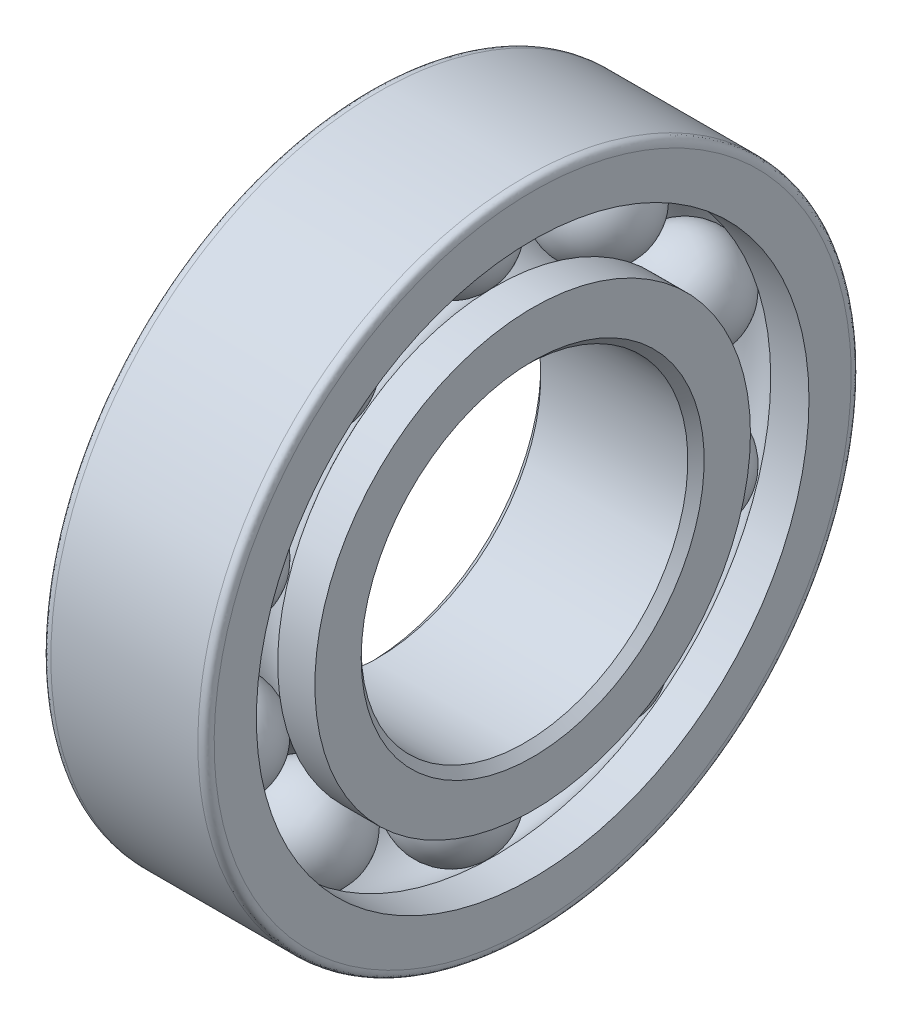
ISO-10303-21;
HEADER;
FILE_DESCRIPTION(('STEP AP214'),'2;1');
FILE_NAME('part.step','',(''),(''),'','','');
FILE_SCHEMA(('AUTOMOTIVE_DESIGN { 1 0 10303 214 1 1 1 1 }'));
ENDSEC;
DATA;
#1=APPLICATION_CONTEXT('core data for automotive mechanical design processes');
#2=APPLICATION_PROTOCOL_DEFINITION('international standard','automotive_design',2000,#1);
#3=PRODUCT_CONTEXT('',#1,'mechanical');
#4=PRODUCT('Part','Part','',(#3));
#5=PRODUCT_RELATED_PRODUCT_CATEGORY('part','',(#4));
#6=PRODUCT_DEFINITION_FORMATION('','',#4);
#7=PRODUCT_DEFINITION_CONTEXT('part definition',#1,'design');
#8=PRODUCT_DEFINITION('design','',#6,#7);
#9=PRODUCT_DEFINITION_SHAPE('','',#8);
#10=(LENGTH_UNIT() NAMED_UNIT(*) SI_UNIT(.MILLI.,.METRE.));
#11=(NAMED_UNIT(*) PLANE_ANGLE_UNIT() SI_UNIT($,.RADIAN.));
#12=(NAMED_UNIT(*) SI_UNIT($,.STERADIAN.) SOLID_ANGLE_UNIT());
#13=UNCERTAINTY_MEASURE_WITH_UNIT(LENGTH_MEASURE(1.E-05),#10,'distance_accuracy_value','');
#14=(GEOMETRIC_REPRESENTATION_CONTEXT(3) GLOBAL_UNCERTAINTY_ASSIGNED_CONTEXT((#13)) GLOBAL_UNIT_ASSIGNED_CONTEXT((#10,
#11,#12)) REPRESENTATION_CONTEXT('',''));
#15=CARTESIAN_POINT('',(0.,0.,0.));
#16=DIRECTION('',(0.,0.,1.));
#17=DIRECTION('',(1.,0.,0.));
#18=AXIS2_PLACEMENT_3D('',#15,#16,#17);
#19=CARTESIAN_POINT('',(0.,7.31351362914959,-5.31357868072386));
#20=DIRECTION('',(-1.,0.,0.));
#21=DIRECTION('',(0.,0.809016994374955,-0.587785252292462));
#22=AXIS2_PLACEMENT_3D('',#19,#20,#21);
#23=SPHERICAL_SURFACE('',#22,1.9);
#24=CARTESIAN_POINT('',(-1.9,7.31351362914959,-5.31357868072386));
#25=VERTEX_POINT('',#24);
#26=VERTEX_LOOP('',#25);
#27=FACE_BOUND('',#26,.T.);
#28=ADVANCED_FACE('F40',(#27),#23,.T.);
#29=CLOSED_SHELL('',(#28));
#30=MANIFOLD_SOLID_BREP('B2',#29);
#31=CARTESIAN_POINT('',(0.,2.79351362914962,-8.59755090730816));
#32=DIRECTION('',(-1.,0.,0.));
#33=DIRECTION('',(0.,0.309016994374958,-0.95105651629515));
#34=AXIS2_PLACEMENT_3D('',#31,#32,#33);
#35=SPHERICAL_SURFACE('',#34,1.9);
#36=CARTESIAN_POINT('',(-1.9,2.79351362914962,-8.59755090730816));
#37=VERTEX_POINT('',#36);
#38=VERTEX_LOOP('',#37);
#39=FACE_BOUND('',#38,.T.);
#40=ADVANCED_FACE('F59',(#39),#35,.T.);
#41=CLOSED_SHELL('',(#40));
#42=MANIFOLD_SOLID_BREP('B6',#41);
#43=CARTESIAN_POINT('',(0.,-2.79351362914944,-8.59755090730821));
#44=DIRECTION('',(-1.,0.,0.));
#45=DIRECTION('',(0.,-0.309016994374938,-0.951056516295157));
#46=AXIS2_PLACEMENT_3D('',#43,#44,#45);
#47=SPHERICAL_SURFACE('',#46,1.9);
#48=CARTESIAN_POINT('',(-1.9,-2.79351362914944,-8.59755090730821));
#49=VERTEX_POINT('',#48);
#50=VERTEX_LOOP('',#49);
#51=FACE_BOUND('',#50,.T.);
#52=ADVANCED_FACE('F78',(#51),#47,.T.);
#53=CLOSED_SHELL('',(#52));
#54=MANIFOLD_SOLID_BREP('B36',#53);
#55=CARTESIAN_POINT('',(0.,-7.31351362914948,-5.31357868072402));
#56=DIRECTION('',(-1.,0.,0.));
#57=DIRECTION('',(0.,-0.809016994374942,-0.58778525229248));
#58=AXIS2_PLACEMENT_3D('',#55,#56,#57);
#59=SPHERICAL_SURFACE('',#58,1.9);
#60=CARTESIAN_POINT('',(-1.9,-7.31351362914948,-5.31357868072402));
#61=VERTEX_POINT('',#60);
#62=VERTEX_LOOP('',#61);
#63=FACE_BOUND('',#62,.T.);
#64=ADVANCED_FACE('F97',(#63),#59,.T.);
#65=CLOSED_SHELL('',(#64));
#66=MANIFOLD_SOLID_BREP('B55',#65);
#67=CARTESIAN_POINT('',(0.,-9.04,0.));
#68=DIRECTION('',(-1.,0.,0.));
#69=DIRECTION('',(0.,-1.,0.));
#70=AXIS2_PLACEMENT_3D('',#67,#68,#69);
#71=SPHERICAL_SURFACE('',#70,1.9);
#72=CARTESIAN_POINT('',(-1.9,-9.04,0.));
#73=VERTEX_POINT('',#72);
#74=VERTEX_LOOP('',#73);
#75=FACE_BOUND('',#74,.T.);
#76=ADVANCED_FACE('F116',(#75),#71,.T.);
#77=CLOSED_SHELL('',(#76));
#78=MANIFOLD_SOLID_BREP('B74',#77);
#79=CARTESIAN_POINT('',(0.,-7.31351362914955,5.31357868072392));
#80=DIRECTION('',(-1.,0.,0.));
#81=DIRECTION('',(0.,-0.809016994374951,0.587785252292469));
#82=AXIS2_PLACEMENT_3D('',#79,#80,#81);
#83=SPHERICAL_SURFACE('',#82,1.9);
#84=CARTESIAN_POINT('',(-1.9,-7.31351362914955,5.31357868072392));
#85=VERTEX_POINT('',#84);
#86=VERTEX_LOOP('',#85);
#87=FACE_BOUND('',#86,.T.);
#88=ADVANCED_FACE('F135',(#87),#83,.T.);
#89=CLOSED_SHELL('',(#88));
#90=MANIFOLD_SOLID_BREP('B93',#89);
#91=CARTESIAN_POINT('',(0.,-2.79351362914956,8.59755090730818));
#92=DIRECTION('',(-1.,0.,0.));
#93=DIRECTION('',(0.,-0.309016994374952,0.951056516295152));
#94=AXIS2_PLACEMENT_3D('',#91,#92,#93);
#95=SPHERICAL_SURFACE('',#94,1.9);
#96=CARTESIAN_POINT('',(-1.9,-2.79351362914956,8.59755090730818));
#97=VERTEX_POINT('',#96);
#98=VERTEX_LOOP('',#97);
#99=FACE_BOUND('',#98,.T.);
#100=ADVANCED_FACE('F154',(#99),#95,.T.);
#101=CLOSED_SHELL('',(#100));
#102=MANIFOLD_SOLID_BREP('B112',#101);
#103=CARTESIAN_POINT('',(0.,2.7935136291495,8.5975509073082));
#104=DIRECTION('',(-1.,0.,0.));
#105=DIRECTION('',(0.,0.309016994374945,0.951056516295155));
#106=AXIS2_PLACEMENT_3D('',#103,#104,#105);
#107=SPHERICAL_SURFACE('',#106,1.9);
#108=CARTESIAN_POINT('',(-1.9,2.7935136291495,8.5975509073082));
#109=VERTEX_POINT('',#108);
#110=VERTEX_LOOP('',#109);
#111=FACE_BOUND('',#110,.T.);
#112=ADVANCED_FACE('F173',(#111),#107,.T.);
#113=CLOSED_SHELL('',(#112));
#114=MANIFOLD_SOLID_BREP('B131',#113);
#115=CARTESIAN_POINT('',(0.,7.31351362914952,5.31357868072397));
#116=DIRECTION('',(-1.,0.,0.));
#117=DIRECTION('',(0.,0.809016994374947,0.587785252292474));
#118=AXIS2_PLACEMENT_3D('',#115,#116,#117);
#119=SPHERICAL_SURFACE('',#118,1.9);
#120=CARTESIAN_POINT('',(-1.9,7.31351362914952,5.31357868072397));
#121=VERTEX_POINT('',#120);
#122=VERTEX_LOOP('',#121);
#123=FACE_BOUND('',#122,.T.);
#124=ADVANCED_FACE('F192',(#123),#119,.T.);
#125=CLOSED_SHELL('',(#124));
#126=MANIFOLD_SOLID_BREP('B150',#125);
#127=CARTESIAN_POINT('',(0.,9.04,0.));
#128=DIRECTION('',(-1.,0.,0.));
#129=DIRECTION('',(0.,1.,0.));
#130=AXIS2_PLACEMENT_3D('',#127,#128,#129);
#131=SPHERICAL_SURFACE('',#130,1.9);
#132=CARTESIAN_POINT('',(-1.9,9.04,0.));
#133=VERTEX_POINT('',#132);
#134=VERTEX_LOOP('',#133);
#135=FACE_BOUND('',#134,.T.);
#136=ADVANCED_FACE('F213',(#135),#131,.T.);
#137=CLOSED_SHELL('',(#136));
#138=MANIFOLD_SOLID_BREP('B169',#137);
#139=CARTESIAN_POINT('',(0.,0.,0.));
#140=DIRECTION('',(1.,0.,0.));
#141=DIRECTION('',(0.,0.,-1.));
#142=AXIS2_PLACEMENT_3D('',#139,#140,#141);
#143=TOROIDAL_SURFACE('',#142,9.04490767290841,1.93996975534355);
#144=CARTESIAN_POINT('',(1.63451846326215,0.,0.));
#145=DIRECTION('',(1.,0.,0.));
#146=DIRECTION('',(0.,0.,-1.));
#147=AXIS2_PLACEMENT_3D('',#144,#145,#146);
#148=CIRCLE('',#147,8.);
#149=CARTESIAN_POINT('',(1.63451846326215,0.,-8.));
#150=VERTEX_POINT('',#149);
#151=EDGE_CURVE('E262',#150,#150,#148,.T.);
#152=ORIENTED_EDGE('',*,*,#151,.F.);
#153=EDGE_LOOP('',(#152));
#154=FACE_BOUND('',#153,.T.);
#155=CARTESIAN_POINT('',(-1.63451846326215,0.,0.));
#156=DIRECTION('',(1.,0.,0.));
#157=DIRECTION('',(0.,0.,-1.));
#158=AXIS2_PLACEMENT_3D('',#155,#156,#157);
#159=CIRCLE('',#158,8.);
#160=CARTESIAN_POINT('',(-1.63451846326215,0.,-8.));
#161=VERTEX_POINT('',#160);
#162=EDGE_CURVE('E253',#161,#161,#159,.T.);
#163=ORIENTED_EDGE('',*,*,#162,.T.);
#164=EDGE_LOOP('',(#163));
#165=FACE_BOUND('',#164,.T.);
#166=ADVANCED_FACE('F233',(#154,#165),#143,.F.);
#167=CARTESIAN_POINT('',(0.,0.,0.));
#168=DIRECTION('',(1.,0.,0.));
#169=DIRECTION('',(0.,0.,-1.));
#170=AXIS2_PLACEMENT_3D('',#167,#168,#169);
#171=CYLINDRICAL_SURFACE('',#170,8.);
#172=CARTESIAN_POINT('',(-3.,0.,0.));
#173=DIRECTION('',(1.,0.,0.));
#174=DIRECTION('',(0.,0.,-1.));
#175=AXIS2_PLACEMENT_3D('',#172,#173,#174);
#176=CIRCLE('',#175,8.);
#177=CARTESIAN_POINT('',(-3.,0.,-8.));
#178=VERTEX_POINT('',#177);
#179=EDGE_CURVE('E256',#178,#178,#176,.T.);
#180=ORIENTED_EDGE('',*,*,#179,.T.);
#181=EDGE_LOOP('',(#180));
#182=FACE_BOUND('',#181,.T.);
#183=ORIENTED_EDGE('',*,*,#162,.F.);
#184=EDGE_LOOP('',(#183));
#185=FACE_BOUND('',#184,.T.);
#186=ADVANCED_FACE('F271',(#182,#185),#171,.T.);
#187=CARTESIAN_POINT('',(-3.,0.,0.));
#188=DIRECTION('',(-1.,0.,0.));
#189=DIRECTION('',(0.,0.,1.));
#190=AXIS2_PLACEMENT_3D('',#187,#188,#189);
#191=PLANE('',#190);
#192=CARTESIAN_POINT('',(-3.,0.,0.));
#193=DIRECTION('',(-1.,0.,0.));
#194=DIRECTION('',(0.,0.,1.));
#195=AXIS2_PLACEMENT_3D('',#192,#193,#194);
#196=CIRCLE('',#195,6.3);
#197=CARTESIAN_POINT('',(-3.,0.,6.3));
#198=VERTEX_POINT('',#197);
#199=EDGE_CURVE('E212',#198,#198,#196,.F.);
#200=ORIENTED_EDGE('',*,*,#199,.T.);
#201=EDGE_LOOP('',(#200));
#202=FACE_BOUND('',#201,.T.);
#203=ORIENTED_EDGE('',*,*,#179,.F.);
#204=EDGE_LOOP('',(#203));
#205=FACE_BOUND('',#204,.T.);
#206=ADVANCED_FACE('F276',(#202,#205),#191,.T.);
#207=CARTESIAN_POINT('',(0.,0.,0.));
#208=DIRECTION('',(1.,0.,0.));
#209=DIRECTION('',(0.,0.,-1.));
#210=AXIS2_PLACEMENT_3D('',#207,#208,#209);
#211=CYLINDRICAL_SURFACE('',#210,6.);
#212=CARTESIAN_POINT('',(2.7,0.,0.));
#213=DIRECTION('',(-1.,0.,0.));
#214=DIRECTION('',(0.,0.,1.));
#215=AXIS2_PLACEMENT_3D('',#212,#213,#214);
#216=CIRCLE('',#215,6.);
#217=CARTESIAN_POINT('',(2.7,0.,6.));
#218=VERTEX_POINT('',#217);
#219=EDGE_CURVE('E244',#218,#218,#216,.F.);
#220=ORIENTED_EDGE('',*,*,#219,.T.);
#221=EDGE_LOOP('',(#220));
#222=FACE_BOUND('',#221,.T.);
#223=CARTESIAN_POINT('',(-2.7,0.,0.));
#224=DIRECTION('',(-1.,0.,0.));
#225=DIRECTION('',(0.,0.,1.));
#226=AXIS2_PLACEMENT_3D('',#223,#224,#225);
#227=CIRCLE('',#226,6.);
#228=CARTESIAN_POINT('',(-2.7,0.,6.));
#229=VERTEX_POINT('',#228);
#230=EDGE_CURVE('E248',#229,#229,#227,.T.);
#231=ORIENTED_EDGE('',*,*,#230,.T.);
#232=EDGE_LOOP('',(#231));
#233=FACE_BOUND('',#232,.T.);
#234=ADVANCED_FACE('F282',(#222,#233),#211,.F.);
#235=CARTESIAN_POINT('',(3.,0.,0.));
#236=DIRECTION('',(-1.,0.,0.));
#237=DIRECTION('',(0.,0.,1.));
#238=AXIS2_PLACEMENT_3D('',#235,#236,#237);
#239=PLANE('',#238);
#240=CARTESIAN_POINT('',(3.,0.,0.));
#241=DIRECTION('',(-1.,0.,0.));
#242=DIRECTION('',(0.,0.,1.));
#243=AXIS2_PLACEMENT_3D('',#240,#241,#242);
#244=CIRCLE('',#243,6.3);
#245=CARTESIAN_POINT('',(3.,0.,6.3));
#246=VERTEX_POINT('',#245);
#247=EDGE_CURVE('E240',#246,#246,#244,.T.);
#248=ORIENTED_EDGE('',*,*,#247,.T.);
#249=EDGE_LOOP('',(#248));
#250=FACE_BOUND('',#249,.T.);
#251=CARTESIAN_POINT('',(3.,0.,0.));
#252=DIRECTION('',(1.,0.,0.));
#253=DIRECTION('',(0.,0.,-1.));
#254=AXIS2_PLACEMENT_3D('',#251,#252,#253);
#255=CIRCLE('',#254,8.);
#256=CARTESIAN_POINT('',(3.,0.,-8.));
#257=VERTEX_POINT('',#256);
#258=EDGE_CURVE('E259',#257,#257,#255,.T.);
#259=ORIENTED_EDGE('',*,*,#258,.T.);
#260=EDGE_LOOP('',(#259));
#261=FACE_BOUND('',#260,.T.);
#262=ADVANCED_FACE('F287',(#250,#261),#239,.F.);
#263=ORIENTED_EDGE('',*,*,#151,.T.);
#264=EDGE_LOOP('',(#263));
#265=FACE_BOUND('',#264,.T.);
#266=ORIENTED_EDGE('',*,*,#258,.F.);
#267=EDGE_LOOP('',(#266));
#268=FACE_BOUND('',#267,.T.);
#269=ADVANCED_FACE('F266',(#265,#268),#171,.T.);
#270=CARTESIAN_POINT('',(2.7,0.,0.));
#271=DIRECTION('',(1.,0.,0.));
#272=DIRECTION('',(0.,0.,-1.));
#273=AXIS2_PLACEMENT_3D('',#270,#271,#272);
#274=CONICAL_SURFACE('',#273,6.,0.78539816339745);
#275=ORIENTED_EDGE('',*,*,#247,.F.);
#276=EDGE_LOOP('',(#275));
#277=FACE_BOUND('',#276,.T.);
#278=ORIENTED_EDGE('',*,*,#219,.F.);
#279=EDGE_LOOP('',(#278));
#280=FACE_BOUND('',#279,.T.);
#281=ADVANCED_FACE('F286',(#277,#280),#274,.F.);
#282=CARTESIAN_POINT('',(-3.,0.,0.));
#283=DIRECTION('',(-1.,0.,0.));
#284=DIRECTION('',(0.,0.,1.));
#285=AXIS2_PLACEMENT_3D('',#282,#283,#284);
#286=CONICAL_SURFACE('',#285,6.3,0.785398163397448);
#287=ORIENTED_EDGE('',*,*,#230,.F.);
#288=EDGE_LOOP('',(#287));
#289=FACE_BOUND('',#288,.T.);
#290=ORIENTED_EDGE('',*,*,#199,.F.);
#291=EDGE_LOOP('',(#290));
#292=FACE_BOUND('',#291,.T.);
#293=ADVANCED_FACE('F235',(#289,#292),#286,.F.);
#294=CLOSED_SHELL('',(#166,#186,#206,#234,#262,#269,#281,#293));
#295=MANIFOLD_SOLID_BREP('B188',#294);
#296=CARTESIAN_POINT('',(0.,0.,0.));
#297=DIRECTION('',(1.,0.,0.));
#298=DIRECTION('',(0.,0.,-1.));
#299=AXIS2_PLACEMENT_3D('',#296,#297,#298);
#300=TOROIDAL_SURFACE('',#299,9.04490767290841,1.93996975534355);
#301=CARTESIAN_POINT('',(-1.59444460557619,0.,0.));
#302=DIRECTION('',(1.,0.,0.));
#303=DIRECTION('',(0.,0.,-1.));
#304=AXIS2_PLACEMENT_3D('',#301,#302,#303);
#305=CIRCLE('',#304,10.15);
#306=CARTESIAN_POINT('',(-1.59444460557619,0.,-10.15));
#307=VERTEX_POINT('',#306);
#308=EDGE_CURVE('E544',#307,#307,#305,.T.);
#309=ORIENTED_EDGE('',*,*,#308,.F.);
#310=EDGE_LOOP('',(#309));
#311=FACE_BOUND('',#310,.T.);
#312=CARTESIAN_POINT('',(1.59444460557619,0.,0.));
#313=DIRECTION('',(1.,0.,0.));
#314=DIRECTION('',(0.,0.,-1.));
#315=AXIS2_PLACEMENT_3D('',#312,#313,#314);
#316=CIRCLE('',#315,10.15);
#317=CARTESIAN_POINT('',(1.59444460557619,0.,-10.15));
#318=VERTEX_POINT('',#317);
#319=EDGE_CURVE('E382',#318,#318,#316,.T.);
#320=ORIENTED_EDGE('',*,*,#319,.T.);
#321=EDGE_LOOP('',(#320));
#322=FACE_BOUND('',#321,.T.);
#323=ADVANCED_FACE('F354',(#311,#322),#300,.F.);
#324=CARTESIAN_POINT('',(0.,0.,0.));
#325=DIRECTION('',(1.,0.,0.));
#326=DIRECTION('',(0.,0.,-1.));
#327=AXIS2_PLACEMENT_3D('',#324,#325,#326);
#328=CYLINDRICAL_SURFACE('',#327,10.15);
#329=ORIENTED_EDGE('',*,*,#319,.F.);
#330=EDGE_LOOP('',(#329));
#331=FACE_BOUND('',#330,.T.);
#332=CARTESIAN_POINT('',(3.,0.,0.));
#333=DIRECTION('',(1.,0.,0.));
#334=DIRECTION('',(0.,0.,-1.));
#335=AXIS2_PLACEMENT_3D('',#332,#333,#334);
#336=CIRCLE('',#335,10.15);
#337=CARTESIAN_POINT('',(3.,0.,-10.15));
#338=VERTEX_POINT('',#337);
#339=EDGE_CURVE('E387',#338,#338,#336,.T.);
#340=ORIENTED_EDGE('',*,*,#339,.T.);
#341=EDGE_LOOP('',(#340));
#342=FACE_BOUND('',#341,.T.);
#343=ADVANCED_FACE('F411',(#331,#342),#328,.F.);
#344=CARTESIAN_POINT('',(3.,0.,0.));
#345=DIRECTION('',(-1.,0.,0.));
#346=DIRECTION('',(0.,0.,1.));
#347=AXIS2_PLACEMENT_3D('',#344,#345,#346);
#348=PLANE('',#347);
#349=CARTESIAN_POINT('',(3.,0.,-11.7));
#350=CARTESIAN_POINT('',(3.,-1.53132032591848,-11.7));
#351=CARTESIAN_POINT('',(3.,-4.5939609777554,-11.09080289751));
#352=CARTESIAN_POINT('',(3.,-8.48853304100759,-8.48853304100755));
#353=CARTESIAN_POINT('',(3.,-11.0908028975099,-4.59396097775548));
#354=CARTESIAN_POINT('',(3.,-12.004598551245,0.));
#355=CARTESIAN_POINT('',(3.,-11.0908028975099,4.59396097775543));
#356=CARTESIAN_POINT('',(3.,-8.48853304100757,8.48853304100759));
#357=CARTESIAN_POINT('',(3.,-4.59396097775544,11.0908028975099));
#358=CARTESIAN_POINT('',(3.,0.,12.004598551245));
#359=CARTESIAN_POINT('',(3.,4.59396097775544,11.0908028975099));
#360=CARTESIAN_POINT('',(3.,8.48853304100757,8.48853304100758));
#361=CARTESIAN_POINT('',(3.,11.0908028975099,4.59396097775543));
#362=CARTESIAN_POINT('',(3.,12.004598551245,0.));
#363=CARTESIAN_POINT('',(3.,11.0908028975099,-4.59396097775544));
#364=CARTESIAN_POINT('',(3.,8.48853304100756,-8.48853304100758));
#365=CARTESIAN_POINT('',(3.,4.59396097775547,-11.0908028975099));
#366=CARTESIAN_POINT('',(3.,1.53132032591848,-11.7));
#367=CARTESIAN_POINT('',(3.,0.,-11.7));
#368=B_SPLINE_CURVE_WITH_KNOTS('',3,(#349,#350,#351,#352,#353,#354,#355,#356,#357,#358,#359,
#360,#361,#362,#363,#364,#365,#366,#367),.UNSPECIFIED.,.T.,.F.,(4,1,1,1,1,1,1,1,1,1,1,1,1,1,1,1,
4),(-3.14159265358979,-2.74889357189107,-2.35619449019235,-1.96349540849362,-1.5707963267949,
-1.17809724509617,-0.785398163397448,-0.392699081698724,0.,0.392699081698724,0.785398163397448,
1.17809724509617,1.5707963267949,1.96349540849362,2.35619449019234,2.74889357189107,
3.14159265358979),.UNSPECIFIED.);
#369=CARTESIAN_POINT('',(3.,0.,-11.7));
#370=VERTEX_POINT('',#369);
#371=EDGE_CURVE('E377',#370,#370,#368,.F.);
#372=ORIENTED_EDGE('',*,*,#371,.T.);
#373=EDGE_LOOP('',(#372));
#374=FACE_BOUND('',#373,.T.);
#375=ORIENTED_EDGE('',*,*,#339,.F.);
#376=EDGE_LOOP('',(#375));
#377=FACE_BOUND('',#376,.T.);
#378=ADVANCED_FACE('F400',(#374,#377),#348,.F.);
#379=CARTESIAN_POINT('',(0.,0.,0.));
#380=DIRECTION('',(1.,0.,0.));
#381=DIRECTION('',(0.,0.,-1.));
#382=AXIS2_PLACEMENT_3D('',#379,#380,#381);
#383=CYLINDRICAL_SURFACE('',#382,12.);
#384=CARTESIAN_POINT('',(2.7,0.,-12.));
#385=CARTESIAN_POINT('',(2.7,1.57058494965998,-12.));
#386=CARTESIAN_POINT('',(2.7,4.71175484897997,-11.3751824589845));
#387=CARTESIAN_POINT('',(2.7,8.70618773436671,-8.70618773436675));
#388=CARTESIAN_POINT('',(2.7,11.3751824589846,-4.71175484897994));
#389=CARTESIAN_POINT('',(2.7,12.3124087705077,0.));
#390=CARTESIAN_POINT('',(2.7,11.3751824589846,4.71175484897992));
#391=CARTESIAN_POINT('',(2.7,8.70618773436673,8.70618773436674));
#392=CARTESIAN_POINT('',(2.7,4.71175484897993,11.3751824589845));
#393=CARTESIAN_POINT('',(2.7,0.,12.3124087705077));
#394=CARTESIAN_POINT('',(2.7,-4.71175484897993,11.3751824589845));
#395=CARTESIAN_POINT('',(2.7,-8.70618773436673,8.70618773436675));
#396=CARTESIAN_POINT('',(2.7,-11.3751824589845,4.71175484897993));
#397=CARTESIAN_POINT('',(2.7,-12.3124087705077,0.));
#398=CARTESIAN_POINT('',(2.7,-11.3751824589845,-4.71175484897997));
#399=CARTESIAN_POINT('',(2.7,-8.70618773436675,-8.70618773436671));
#400=CARTESIAN_POINT('',(2.7,-4.7117548489799,-11.3751824589846));
#401=CARTESIAN_POINT('',(2.7,-1.57058494965998,-12.));
#402=CARTESIAN_POINT('',(2.7,0.,-12.));
#403=B_SPLINE_CURVE_WITH_KNOTS('',3,(#384,#385,#386,#387,#388,#389,#390,#391,#392,#393,#394,
#395,#396,#397,#398,#399,#400,#401,#402),.UNSPECIFIED.,.T.,.F.,(4,1,1,1,1,1,1,1,1,1,1,1,1,1,1,1,
4),(-3.14159265358979,-2.74889357189107,-2.35619449019234,-1.96349540849362,-1.5707963267949,
-1.17809724509617,-0.785398163397448,-0.392699081698724,0.,0.392699081698724,0.785398163397448,
1.17809724509617,1.5707963267949,1.96349540849362,2.35619449019235,2.74889357189107,
3.14159265358979),.UNSPECIFIED.);
#404=CARTESIAN_POINT('',(2.7,0.,-12.));
#405=VERTEX_POINT('',#404);
#406=EDGE_CURVE('E367',#405,#405,#403,.F.);
#407=ORIENTED_EDGE('',*,*,#406,.T.);
#408=EDGE_LOOP('',(#407));
#409=FACE_BOUND('',#408,.T.);
#410=CARTESIAN_POINT('',(-2.7,0.,-12.));
#411=CARTESIAN_POINT('',(-2.7,-1.57058494965998,-12.));
#412=CARTESIAN_POINT('',(-2.7,-4.7117548489799,-11.3751824589846));
#413=CARTESIAN_POINT('',(-2.7,-8.70618773436675,-8.70618773436671));
#414=CARTESIAN_POINT('',(-2.7,-11.3751824589845,-4.71175484897997));
#415=CARTESIAN_POINT('',(-2.7,-12.3124087705077,0.));
#416=CARTESIAN_POINT('',(-2.7,-11.3751824589845,4.71175484897993));
#417=CARTESIAN_POINT('',(-2.7,-8.70618773436673,8.70618773436675));
#418=CARTESIAN_POINT('',(-2.7,-4.71175484897993,11.3751824589845));
#419=CARTESIAN_POINT('',(-2.7,0.,12.3124087705077));
#420=CARTESIAN_POINT('',(-2.7,4.71175484897993,11.3751824589845));
#421=CARTESIAN_POINT('',(-2.7,8.70618773436673,8.70618773436674));
#422=CARTESIAN_POINT('',(-2.7,11.3751824589846,4.71175484897992));
#423=CARTESIAN_POINT('',(-2.7,12.3124087705077,0.));
#424=CARTESIAN_POINT('',(-2.7,11.3751824589846,-4.71175484897994));
#425=CARTESIAN_POINT('',(-2.7,8.70618773436671,-8.70618773436675));
#426=CARTESIAN_POINT('',(-2.7,4.71175484897997,-11.3751824589845));
#427=CARTESIAN_POINT('',(-2.7,1.57058494965998,-12.));
#428=CARTESIAN_POINT('',(-2.7,0.,-12.));
#429=B_SPLINE_CURVE_WITH_KNOTS('',3,(#410,#411,#412,#413,#414,#415,#416,#417,#418,#419,#420,
#421,#422,#423,#424,#425,#426,#427,#428),.UNSPECIFIED.,.T.,.F.,(4,1,1,1,1,1,1,1,1,1,1,1,1,1,1,1,
4),(-3.14159265358979,-2.74889357189107,-2.35619449019235,-1.96349540849362,-1.5707963267949,
-1.17809724509617,-0.785398163397448,-0.392699081698724,0.,0.392699081698724,0.785398163397448,
1.17809724509617,1.5707963267949,1.96349540849362,2.35619449019234,2.74889357189107,
3.14159265358979),.UNSPECIFIED.);
#430=CARTESIAN_POINT('',(-2.7,0.,-12.));
#431=VERTEX_POINT('',#430);
#432=EDGE_CURVE('E372',#431,#431,#429,.F.);
#433=ORIENTED_EDGE('',*,*,#432,.T.);
#434=EDGE_LOOP('',(#433));
#435=FACE_BOUND('',#434,.T.);
#436=ADVANCED_FACE('F410',(#409,#435),#383,.T.);
#437=CARTESIAN_POINT('',(-3.,0.,0.));
#438=DIRECTION('',(-1.,0.,0.));
#439=DIRECTION('',(0.,0.,1.));
#440=AXIS2_PLACEMENT_3D('',#437,#438,#439);
#441=PLANE('',#440);
#442=CARTESIAN_POINT('',(-3.,0.,-11.7));
#443=CARTESIAN_POINT('',(-3.,1.53132032591848,-11.7));
#444=CARTESIAN_POINT('',(-3.,4.59396097775547,-11.0908028975099));
#445=CARTESIAN_POINT('',(-3.,8.48853304100755,-8.48853304100757));
#446=CARTESIAN_POINT('',(-3.,11.0908028975099,-4.59396097775544));
#447=CARTESIAN_POINT('',(-3.,12.004598551245,0.));
#448=CARTESIAN_POINT('',(-3.,11.0908028975099,4.59396097775542));
#449=CARTESIAN_POINT('',(-3.,8.48853304100757,8.48853304100757));
#450=CARTESIAN_POINT('',(-3.,4.59396097775544,11.0908028975099));
#451=CARTESIAN_POINT('',(-3.,0.,12.004598551245));
#452=CARTESIAN_POINT('',(-3.,-4.59396097775543,11.0908028975099));
#453=CARTESIAN_POINT('',(-3.,-8.48853304100756,8.48853304100758));
#454=CARTESIAN_POINT('',(-3.,-11.0908028975099,4.59396097775543));
#455=CARTESIAN_POINT('',(-3.,-12.004598551245,0.));
#456=CARTESIAN_POINT('',(-3.,-11.0908028975099,-4.59396097775547));
#457=CARTESIAN_POINT('',(-3.,-8.48853304100758,-8.48853304100754));
#458=CARTESIAN_POINT('',(-3.,-4.5939609777554,-11.09080289751));
#459=CARTESIAN_POINT('',(-3.,-1.53132032591848,-11.7));
#460=CARTESIAN_POINT('',(-3.,0.,-11.7));
#461=B_SPLINE_CURVE_WITH_KNOTS('',3,(#442,#443,#444,#445,#446,#447,#448,#449,#450,#451,#452,
#453,#454,#455,#456,#457,#458,#459,#460),.UNSPECIFIED.,.T.,.F.,(4,1,1,1,1,1,1,1,1,1,1,1,1,1,1,1,
4),(-3.14159265358979,-2.74889357189107,-2.35619449019234,-1.96349540849362,-1.5707963267949,
-1.17809724509617,-0.785398163397448,-0.392699081698724,0.,0.392699081698724,0.785398163397448,
1.17809724509617,1.5707963267949,1.96349540849362,2.35619449019235,2.74889357189107,
3.14159265358979),.UNSPECIFIED.);
#462=CARTESIAN_POINT('',(-3.,0.,-11.7));
#463=VERTEX_POINT('',#462);
#464=EDGE_CURVE('E232',#463,#463,#461,.F.);
#465=ORIENTED_EDGE('',*,*,#464,.T.);
#466=EDGE_LOOP('',(#465));
#467=FACE_BOUND('',#466,.T.);
#468=CARTESIAN_POINT('',(-3.,0.,0.));
#469=DIRECTION('',(1.,0.,0.));
#470=DIRECTION('',(0.,0.,-1.));
#471=AXIS2_PLACEMENT_3D('',#468,#469,#470);
#472=CIRCLE('',#471,10.15);
#473=CARTESIAN_POINT('',(-3.,0.,-10.15));
#474=VERTEX_POINT('',#473);
#475=EDGE_CURVE('E392',#474,#474,#472,.T.);
#476=ORIENTED_EDGE('',*,*,#475,.T.);
#477=EDGE_LOOP('',(#476));
#478=FACE_BOUND('',#477,.T.);
#479=ADVANCED_FACE('F470',(#467,#478),#441,.T.);
#480=ORIENTED_EDGE('',*,*,#475,.F.);
#481=EDGE_LOOP('',(#480));
#482=FACE_BOUND('',#481,.T.);
#483=ORIENTED_EDGE('',*,*,#308,.T.);
#484=EDGE_LOOP('',(#483));
#485=FACE_BOUND('',#484,.T.);
#486=ADVANCED_FACE('F424',(#482,#485),#328,.F.);
#487=CARTESIAN_POINT('',(2.7,0.,-12.));
#488=CARTESIAN_POINT('',(2.7,-1.57058494965998,-12.));
#489=CARTESIAN_POINT('',(2.7,-4.7117548489799,-11.3751824589846));
#490=CARTESIAN_POINT('',(2.7,-8.70618773436675,-8.70618773436671));
#491=CARTESIAN_POINT('',(2.7,-11.3751824589845,-4.71175484897997));
#492=CARTESIAN_POINT('',(2.7,-12.3124087705077,0.));
#493=CARTESIAN_POINT('',(2.7,-11.3751824589845,4.71175484897993));
#494=CARTESIAN_POINT('',(2.7,-8.70618773436673,8.70618773436675));
#495=CARTESIAN_POINT('',(2.7,-4.71175484897993,11.3751824589845));
#496=CARTESIAN_POINT('',(2.7,0.,12.3124087705077));
#497=CARTESIAN_POINT('',(2.7,4.71175484897993,11.3751824589845));
#498=CARTESIAN_POINT('',(2.7,8.70618773436673,8.70618773436674));
#499=CARTESIAN_POINT('',(2.7,11.3751824589846,4.71175484897992));
#500=CARTESIAN_POINT('',(2.7,12.3124087705077,0.));
#501=CARTESIAN_POINT('',(2.7,11.3751824589846,-4.71175484897994));
#502=CARTESIAN_POINT('',(2.7,8.70618773436671,-8.70618773436675));
#503=CARTESIAN_POINT('',(2.7,4.71175484897997,-11.3751824589845));
#504=CARTESIAN_POINT('',(2.7,1.57058494965998,-12.));
#505=CARTESIAN_POINT('',(2.7,0.,-12.));
#506=CARTESIAN_POINT('',(2.75045941546018,0.,-12.));
#507=CARTESIAN_POINT('',(2.75045941546018,-1.57058494965998,-12.));
#508=CARTESIAN_POINT('',(2.75045941546019,-4.7117548489799,-11.3751824589846));
#509=CARTESIAN_POINT('',(2.75045941546018,-8.70618773436675,-8.70618773436671));
#510=CARTESIAN_POINT('',(2.75045941546019,-11.3751824589845,-4.71175484897997));
#511=CARTESIAN_POINT('',(2.75045941546018,-12.3124087705077,0.));
#512=CARTESIAN_POINT('',(2.75045941546019,-11.3751824589845,4.71175484897993));
#513=CARTESIAN_POINT('',(2.75045941546018,-8.70618773436673,8.70618773436675));
#514=CARTESIAN_POINT('',(2.75045941546018,-4.71175484897993,11.3751824589845));
#515=CARTESIAN_POINT('',(2.75045941546018,0.,12.3124087705077));
#516=CARTESIAN_POINT('',(2.75045941546018,4.71175484897993,11.3751824589845));
#517=CARTESIAN_POINT('',(2.75045941546018,8.70618773436673,8.70618773436674));
#518=CARTESIAN_POINT('',(2.75045941546018,11.3751824589846,4.71175484897992));
#519=CARTESIAN_POINT('',(2.75045941546018,12.3124087705077,0.));
#520=CARTESIAN_POINT('',(2.75045941546019,11.3751824589846,-4.71175484897994));
#521=CARTESIAN_POINT('',(2.75045941546018,8.70618773436671,-8.70618773436675));
#522=CARTESIAN_POINT('',(2.75045941546019,4.71175484897997,-11.3751824589845));
#523=CARTESIAN_POINT('',(2.75045941546018,1.57058494965998,-12.));
#524=CARTESIAN_POINT('',(2.75045941546018,0.,-12.));
#525=CARTESIAN_POINT('',(2.80091883092037,0.,-12.));
#526=CARTESIAN_POINT('',(2.80091883092037,-1.57058494965998,-12.));
#527=CARTESIAN_POINT('',(2.80091883092037,-4.7117548489799,-11.3751824589846));
#528=CARTESIAN_POINT('',(2.80091883092037,-8.70618773436675,-8.70618773436671));
#529=CARTESIAN_POINT('',(2.80091883092037,-11.3751824589845,-4.71175484897997));
#530=CARTESIAN_POINT('',(2.80091883092037,-12.3124087705077,0.));
#531=CARTESIAN_POINT('',(2.80091883092037,-11.3751824589845,4.71175484897993));
#532=CARTESIAN_POINT('',(2.80091883092037,-8.70618773436673,8.70618773436675));
#533=CARTESIAN_POINT('',(2.80091883092037,-4.71175484897993,11.3751824589845));
#534=CARTESIAN_POINT('',(2.80091883092037,0.,12.3124087705077));
#535=CARTESIAN_POINT('',(2.80091883092037,4.71175484897993,11.3751824589845));
#536=CARTESIAN_POINT('',(2.80091883092037,8.70618773436673,8.70618773436674));
#537=CARTESIAN_POINT('',(2.80091883092037,11.3751824589846,4.71175484897992));
#538=CARTESIAN_POINT('',(2.80091883092037,12.3124087705077,0.));
#539=CARTESIAN_POINT('',(2.80091883092037,11.3751824589846,-4.71175484897994));
#540=CARTESIAN_POINT('',(2.80091883092037,8.70618773436671,-8.70618773436675));
#541=CARTESIAN_POINT('',(2.80091883092037,4.71175484897997,-11.3751824589845));
#542=CARTESIAN_POINT('',(2.80091883092037,1.57058494965998,-12.));
#543=CARTESIAN_POINT('',(2.80091883092037,0.,-12.));
#544=CARTESIAN_POINT('',(2.91213203435596,0.,-11.9784924240492));
#545=CARTESIAN_POINT('',(2.91213203435596,-1.56776999340231,-11.9784924240492));
#546=CARTESIAN_POINT('',(2.91213203435597,-4.70330998020689,-11.3547947422603));
#547=CARTESIAN_POINT('',(2.91213203435596,-8.6905836515385,-8.69058365153846));
#548=CARTESIAN_POINT('',(2.91213203435597,-11.3547947422603,-4.70330998020696));
#549=CARTESIAN_POINT('',(2.91213203435596,-12.2903412649436,0.));
#550=CARTESIAN_POINT('',(2.91213203435596,-11.3547947422603,4.70330998020692));
#551=CARTESIAN_POINT('',(2.91213203435596,-8.69058365153848,8.69058365153849));
#552=CARTESIAN_POINT('',(2.91213203435596,-4.70330998020692,11.3547947422603));
#553=CARTESIAN_POINT('',(2.91213203435596,0.,12.2903412649436));
#554=CARTESIAN_POINT('',(2.91213203435596,4.70330998020693,11.3547947422603));
#555=CARTESIAN_POINT('',(2.91213203435596,8.69058365153848,8.69058365153849));
#556=CARTESIAN_POINT('',(2.91213203435596,11.3547947422603,4.70330998020691));
#557=CARTESIAN_POINT('',(2.91213203435596,12.2903412649436,0.));
#558=CARTESIAN_POINT('',(2.91213203435597,11.3547947422603,-4.70330998020693));
#559=CARTESIAN_POINT('',(2.91213203435596,8.69058365153847,-8.69058365153849));
#560=CARTESIAN_POINT('',(2.91213203435597,4.70330998020696,-11.3547947422603));
#561=CARTESIAN_POINT('',(2.91213203435596,1.56776999340231,-11.9784924240492));
#562=CARTESIAN_POINT('',(2.91213203435596,0.,-11.9784924240492));
#563=CARTESIAN_POINT('',(2.97849242404918,0.,-11.912132034356));
#564=CARTESIAN_POINT('',(2.97849242404918,-1.55908460762683,-11.912132034356));
#565=CARTESIAN_POINT('',(2.97849242404918,-4.67725382288045,-11.2918896138595));
#566=CARTESIAN_POINT('',(2.97849242404917,-8.64243815063893,-8.64243815063889));
#567=CARTESIAN_POINT('',(2.97849242404918,-11.2918896138595,-4.67725382288053));
#568=CARTESIAN_POINT('',(2.97849242404918,-12.2222532446042,0.));
#569=CARTESIAN_POINT('',(2.97849242404918,-11.2918896138595,4.67725382288049));
#570=CARTESIAN_POINT('',(2.97849242404918,-8.6424381506389,8.64243815063892));
#571=CARTESIAN_POINT('',(2.97849242404917,-4.67725382288049,11.2918896138595));
#572=CARTESIAN_POINT('',(2.97849242404918,0.,12.2222532446042));
#573=CARTESIAN_POINT('',(2.97849242404918,4.67725382288049,11.2918896138595));
#574=CARTESIAN_POINT('',(2.97849242404918,8.64243815063891,8.64243815063892));
#575=CARTESIAN_POINT('',(2.97849242404918,11.2918896138595,4.67725382288048));
#576=CARTESIAN_POINT('',(2.97849242404918,12.2222532446042,0.));
#577=CARTESIAN_POINT('',(2.97849242404918,11.2918896138595,-4.67725382288049));
#578=CARTESIAN_POINT('',(2.97849242404917,8.64243815063889,-8.64243815063892));
#579=CARTESIAN_POINT('',(2.97849242404918,4.67725382288053,-11.2918896138595));
#580=CARTESIAN_POINT('',(2.97849242404918,1.55908460762683,-11.912132034356));
#581=CARTESIAN_POINT('',(2.97849242404918,0.,-11.912132034356));
#582=CARTESIAN_POINT('',(3.,0.,-11.8009188309204));
#583=CARTESIAN_POINT('',(3.,-1.54452879233354,-11.8009188309204));
#584=CARTESIAN_POINT('',(3.,-4.6335863770006,-11.1864670737822));
#585=CARTESIAN_POINT('',(3.,-8.56175123166805,-8.561751231668));
#586=CARTESIAN_POINT('',(3.,-11.1864670737821,-4.63358637700068));
#587=CARTESIAN_POINT('',(3.,-12.1081447094895,0.));
#588=CARTESIAN_POINT('',(3.,-11.1864670737821,4.63358637700063));
#589=CARTESIAN_POINT('',(3.,-8.56175123166802,8.56175123166804));
#590=CARTESIAN_POINT('',(3.,-4.63358637700063,11.1864670737821));
#591=CARTESIAN_POINT('',(3.,0.,12.1081447094895));
#592=CARTESIAN_POINT('',(3.,4.63358637700064,11.1864670737821));
#593=CARTESIAN_POINT('',(3.,8.56175123166803,8.56175123166804));
#594=CARTESIAN_POINT('',(3.,11.1864670737822,4.63358637700063));
#595=CARTESIAN_POINT('',(3.,12.1081447094895,0.));
#596=CARTESIAN_POINT('',(3.,11.1864670737822,-4.63358637700064));
#597=CARTESIAN_POINT('',(3.,8.56175123166801,-8.56175123166804));
#598=CARTESIAN_POINT('',(3.,4.63358637700067,-11.1864670737821));
#599=CARTESIAN_POINT('',(3.,1.54452879233355,-11.8009188309204));
#600=CARTESIAN_POINT('',(3.,0.,-11.8009188309204));
#601=CARTESIAN_POINT('',(3.,0.,-11.7504594154602));
#602=CARTESIAN_POINT('',(3.,-1.53792455912601,-11.7504594154602));
#603=CARTESIAN_POINT('',(3.,-4.613773677378,-11.1386349856461));
#604=CARTESIAN_POINT('',(3.,-8.52514213633782,-8.52514213633777));
#605=CARTESIAN_POINT('',(3.,-11.138634985646,-4.61377367737807));
#606=CARTESIAN_POINT('',(3.,-12.0563716303673,0.));
#607=CARTESIAN_POINT('',(3.,-11.138634985646,4.61377367737803));
#608=CARTESIAN_POINT('',(3.,-8.52514213633779,8.52514213633781));
#609=CARTESIAN_POINT('',(3.,-4.61377367737803,11.138634985646));
#610=CARTESIAN_POINT('',(3.,0.,12.0563716303673));
#611=CARTESIAN_POINT('',(3.,4.61377367737804,11.138634985646));
#612=CARTESIAN_POINT('',(3.,8.5251421363378,8.5251421363378));
#613=CARTESIAN_POINT('',(3.,11.138634985646,4.61377367737802));
#614=CARTESIAN_POINT('',(3.,12.0563716303673,0.));
#615=CARTESIAN_POINT('',(3.,11.138634985646,-4.61377367737804));
#616=CARTESIAN_POINT('',(3.,8.52514213633778,-8.52514213633781));
#617=CARTESIAN_POINT('',(3.,4.61377367737807,-11.138634985646));
#618=CARTESIAN_POINT('',(3.,1.53792455912601,-11.7504594154602));
#619=CARTESIAN_POINT('',(3.,0.,-11.7504594154602));
#620=CARTESIAN_POINT('',(3.,0.,-11.7));
#621=CARTESIAN_POINT('',(3.,-1.53132032591848,-11.7));
#622=CARTESIAN_POINT('',(3.,-4.5939609777554,-11.09080289751));
#623=CARTESIAN_POINT('',(3.,-8.48853304100758,-8.48853304100754));
#624=CARTESIAN_POINT('',(3.,-11.0908028975099,-4.59396097775547));
#625=CARTESIAN_POINT('',(3.,-12.004598551245,0.));
#626=CARTESIAN_POINT('',(3.,-11.0908028975099,4.59396097775543));
#627=CARTESIAN_POINT('',(3.,-8.48853304100756,8.48853304100758));
#628=CARTESIAN_POINT('',(3.,-4.59396097775543,11.0908028975099));
#629=CARTESIAN_POINT('',(3.,0.,12.004598551245));
#630=CARTESIAN_POINT('',(3.,4.59396097775544,11.0908028975099));
#631=CARTESIAN_POINT('',(3.,8.48853304100757,8.48853304100757));
#632=CARTESIAN_POINT('',(3.,11.0908028975099,4.59396097775542));
#633=CARTESIAN_POINT('',(3.,12.004598551245,0.));
#634=CARTESIAN_POINT('',(3.,11.0908028975099,-4.59396097775544));
#635=CARTESIAN_POINT('',(3.,8.48853304100755,-8.48853304100757));
#636=CARTESIAN_POINT('',(3.,4.59396097775547,-11.0908028975099));
#637=CARTESIAN_POINT('',(3.,1.53132032591848,-11.7));
#638=CARTESIAN_POINT('',(3.,0.,-11.7));
#639=B_SPLINE_SURFACE_WITH_KNOTS('',5,3,((#487,#488,#489,#490,#491,#492,#493,#494,#495,#496,
#497,#498,#499,#500,#501,#502,#503,#504,#505),(#506,#507,#508,#509,#510,#511,#512,#513,#514,
#515,#516,#517,#518,#519,#520,#521,#522,#523,#524),(#525,#526,#527,#528,#529,#530,#531,#532,
#533,#534,#535,#536,#537,#538,#539,#540,#541,#542,#543),(#544,#545,#546,#547,#548,#549,#550,
#551,#552,#553,#554,#555,#556,#557,#558,#559,#560,#561,#562),(#563,#564,#565,#566,#567,#568,
#569,#570,#571,#572,#573,#574,#575,#576,#577,#578,#579,#580,#581),(#582,#583,#584,#585,#586,
#587,#588,#589,#590,#591,#592,#593,#594,#595,#596,#597,#598,#599,#600),(#601,#602,#603,#604,
#605,#606,#607,#608,#609,#610,#611,#612,#613,#614,#615,#616,#617,#618,#619),(#620,#621,#622,
#623,#624,#625,#626,#627,#628,#629,#630,#631,#632,#633,#634,#635,#636,#637,#638)),.UNSPECIFIED.,
.F.,.T.,.F.,(6,2,6),(4,1,1,1,1,1,1,1,1,1,1,1,1,1,1,1,4),(0.,0.5,1.),(-3.14159265358979,
-2.74889357189107,-2.35619449019235,-1.96349540849362,-1.5707963267949,-1.17809724509617,
-0.785398163397448,-0.392699081698724,0.,0.392699081698724,0.785398163397448,1.17809724509617,
1.5707963267949,1.96349540849362,2.35619449019234,2.74889357189107,3.14159265358979),.UNSPECIFIED.);
#640=ORIENTED_EDGE('',*,*,#406,.F.);
#641=EDGE_LOOP('',(#640));
#642=FACE_BOUND('',#641,.T.);
#643=ORIENTED_EDGE('',*,*,#371,.F.);
#644=EDGE_LOOP('',(#643));
#645=FACE_BOUND('',#644,.T.);
#646=ADVANCED_FACE('F417',(#642,#645),#639,.T.);
#647=CARTESIAN_POINT('',(-3.,0.,-11.7));
#648=CARTESIAN_POINT('',(-3.,-1.53132032591848,-11.7));
#649=CARTESIAN_POINT('',(-3.,-4.5939609777554,-11.09080289751));
#650=CARTESIAN_POINT('',(-3.,-8.48853304100758,-8.48853304100754));
#651=CARTESIAN_POINT('',(-3.,-11.0908028975099,-4.59396097775547));
#652=CARTESIAN_POINT('',(-3.,-12.004598551245,0.));
#653=CARTESIAN_POINT('',(-3.,-11.0908028975099,4.59396097775543));
#654=CARTESIAN_POINT('',(-3.,-8.48853304100756,8.48853304100758));
#655=CARTESIAN_POINT('',(-3.,-4.59396097775543,11.0908028975099));
#656=CARTESIAN_POINT('',(-3.,0.,12.004598551245));
#657=CARTESIAN_POINT('',(-3.,4.59396097775544,11.0908028975099));
#658=CARTESIAN_POINT('',(-3.,8.48853304100757,8.48853304100757));
#659=CARTESIAN_POINT('',(-3.,11.0908028975099,4.59396097775542));
#660=CARTESIAN_POINT('',(-3.,12.004598551245,0.));
#661=CARTESIAN_POINT('',(-3.,11.0908028975099,-4.59396097775544));
#662=CARTESIAN_POINT('',(-3.,8.48853304100755,-8.48853304100757));
#663=CARTESIAN_POINT('',(-3.,4.59396097775547,-11.0908028975099));
#664=CARTESIAN_POINT('',(-3.,1.53132032591848,-11.7));
#665=CARTESIAN_POINT('',(-3.,0.,-11.7));
#666=CARTESIAN_POINT('',(-3.,0.,-11.7504594154602));
#667=CARTESIAN_POINT('',(-3.,-1.53792455912601,-11.7504594154602));
#668=CARTESIAN_POINT('',(-3.,-4.613773677378,-11.1386349856461));
#669=CARTESIAN_POINT('',(-3.,-8.52514213633782,-8.52514213633777));
#670=CARTESIAN_POINT('',(-3.,-11.138634985646,-4.61377367737807));
#671=CARTESIAN_POINT('',(-3.,-12.0563716303673,0.));
#672=CARTESIAN_POINT('',(-3.,-11.138634985646,4.61377367737803));
#673=CARTESIAN_POINT('',(-3.,-8.52514213633779,8.52514213633781));
#674=CARTESIAN_POINT('',(-3.,-4.61377367737803,11.138634985646));
#675=CARTESIAN_POINT('',(-3.,0.,12.0563716303673));
#676=CARTESIAN_POINT('',(-3.,4.61377367737804,11.138634985646));
#677=CARTESIAN_POINT('',(-3.,8.5251421363378,8.5251421363378));
#678=CARTESIAN_POINT('',(-3.,11.138634985646,4.61377367737802));
#679=CARTESIAN_POINT('',(-3.,12.0563716303673,0.));
#680=CARTESIAN_POINT('',(-3.,11.138634985646,-4.61377367737804));
#681=CARTESIAN_POINT('',(-3.,8.52514213633778,-8.52514213633781));
#682=CARTESIAN_POINT('',(-3.,4.61377367737807,-11.138634985646));
#683=CARTESIAN_POINT('',(-3.,1.53792455912601,-11.7504594154602));
#684=CARTESIAN_POINT('',(-3.,0.,-11.7504594154602));
#685=CARTESIAN_POINT('',(-3.,0.,-11.8009188309204));
#686=CARTESIAN_POINT('',(-3.,-1.54452879233354,-11.8009188309204));
#687=CARTESIAN_POINT('',(-3.,-4.6335863770006,-11.1864670737822));
#688=CARTESIAN_POINT('',(-3.,-8.56175123166805,-8.56175123166801));
#689=CARTESIAN_POINT('',(-3.,-11.1864670737821,-4.63358637700068));
#690=CARTESIAN_POINT('',(-3.,-12.1081447094895,0.));
#691=CARTESIAN_POINT('',(-3.,-11.1864670737821,4.63358637700063));
#692=CARTESIAN_POINT('',(-3.,-8.56175123166802,8.56175123166804));
#693=CARTESIAN_POINT('',(-3.,-4.63358637700063,11.1864670737821));
#694=CARTESIAN_POINT('',(-3.,0.,12.1081447094895));
#695=CARTESIAN_POINT('',(-3.,4.63358637700064,11.1864670737821));
#696=CARTESIAN_POINT('',(-3.,8.56175123166803,8.56175123166804));
#697=CARTESIAN_POINT('',(-3.,11.1864670737822,4.63358637700063));
#698=CARTESIAN_POINT('',(-3.,12.1081447094895,0.));
#699=CARTESIAN_POINT('',(-3.,11.1864670737822,-4.63358637700064));
#700=CARTESIAN_POINT('',(-3.,8.56175123166801,-8.56175123166804));
#701=CARTESIAN_POINT('',(-3.,4.63358637700067,-11.1864670737821));
#702=CARTESIAN_POINT('',(-3.,1.54452879233355,-11.8009188309204));
#703=CARTESIAN_POINT('',(-3.,0.,-11.8009188309204));
#704=CARTESIAN_POINT('',(-2.97849242404918,0.,-11.912132034356));
#705=CARTESIAN_POINT('',(-2.97849242404918,-1.55908460762683,-11.912132034356));
#706=CARTESIAN_POINT('',(-2.97849242404918,-4.67725382288046,-11.2918896138595));
#707=CARTESIAN_POINT('',(-2.97849242404917,-8.64243815063893,-8.64243815063889));
#708=CARTESIAN_POINT('',(-2.97849242404918,-11.2918896138595,-4.67725382288053));
#709=CARTESIAN_POINT('',(-2.97849242404918,-12.2222532446042,0.));
#710=CARTESIAN_POINT('',(-2.97849242404918,-11.2918896138595,4.67725382288049));
#711=CARTESIAN_POINT('',(-2.97849242404918,-8.6424381506389,8.64243815063892));
#712=CARTESIAN_POINT('',(-2.97849242404917,-4.67725382288049,11.2918896138595));
#713=CARTESIAN_POINT('',(-2.97849242404918,0.,12.2222532446042));
#714=CARTESIAN_POINT('',(-2.97849242404918,4.67725382288049,11.2918896138595));
#715=CARTESIAN_POINT('',(-2.97849242404918,8.64243815063891,8.64243815063892));
#716=CARTESIAN_POINT('',(-2.97849242404918,11.2918896138595,4.67725382288048));
#717=CARTESIAN_POINT('',(-2.97849242404917,12.2222532446042,0.));
#718=CARTESIAN_POINT('',(-2.97849242404918,11.2918896138595,-4.67725382288049));
#719=CARTESIAN_POINT('',(-2.97849242404917,8.64243815063889,-8.64243815063892));
#720=CARTESIAN_POINT('',(-2.97849242404918,4.67725382288053,-11.2918896138595));
#721=CARTESIAN_POINT('',(-2.97849242404918,1.55908460762683,-11.912132034356));
#722=CARTESIAN_POINT('',(-2.97849242404918,0.,-11.912132034356));
#723=CARTESIAN_POINT('',(-2.91213203435597,0.,-11.9784924240492));
#724=CARTESIAN_POINT('',(-2.91213203435597,-1.56776999340231,-11.9784924240492));
#725=CARTESIAN_POINT('',(-2.91213203435597,-4.70330998020689,-11.3547947422603));
#726=CARTESIAN_POINT('',(-2.91213203435596,-8.6905836515385,-8.69058365153846));
#727=CARTESIAN_POINT('',(-2.91213203435597,-11.3547947422603,-4.70330998020696));
#728=CARTESIAN_POINT('',(-2.91213203435597,-12.2903412649436,0.));
#729=CARTESIAN_POINT('',(-2.91213203435596,-11.3547947422603,4.70330998020692));
#730=CARTESIAN_POINT('',(-2.91213203435597,-8.69058365153848,8.69058365153849));
#731=CARTESIAN_POINT('',(-2.91213203435596,-4.70330998020692,11.3547947422603));
#732=CARTESIAN_POINT('',(-2.91213203435597,0.,12.2903412649436));
#733=CARTESIAN_POINT('',(-2.91213203435596,4.70330998020692,11.3547947422603));
#734=CARTESIAN_POINT('',(-2.91213203435597,8.69058365153848,8.69058365153849));
#735=CARTESIAN_POINT('',(-2.91213203435596,11.3547947422603,4.70330998020691));
#736=CARTESIAN_POINT('',(-2.91213203435597,12.2903412649436,0.));
#737=CARTESIAN_POINT('',(-2.91213203435596,11.3547947422603,-4.70330998020693));
#738=CARTESIAN_POINT('',(-2.91213203435596,8.69058365153847,-8.69058365153849));
#739=CARTESIAN_POINT('',(-2.91213203435597,4.70330998020696,-11.3547947422603));
#740=CARTESIAN_POINT('',(-2.91213203435597,1.56776999340231,-11.9784924240492));
#741=CARTESIAN_POINT('',(-2.91213203435597,0.,-11.9784924240492));
#742=CARTESIAN_POINT('',(-2.80091883092037,0.,-12.));
#743=CARTESIAN_POINT('',(-2.80091883092037,-1.57058494965998,-12.));
#744=CARTESIAN_POINT('',(-2.80091883092037,-4.7117548489799,-11.3751824589846));
#745=CARTESIAN_POINT('',(-2.80091883092037,-8.70618773436675,-8.70618773436671));
#746=CARTESIAN_POINT('',(-2.80091883092037,-11.3751824589845,-4.71175484897997));
#747=CARTESIAN_POINT('',(-2.80091883092037,-12.3124087705077,0.));
#748=CARTESIAN_POINT('',(-2.80091883092037,-11.3751824589845,4.71175484897993));
#749=CARTESIAN_POINT('',(-2.80091883092037,-8.70618773436673,8.70618773436675));
#750=CARTESIAN_POINT('',(-2.80091883092037,-4.71175484897993,11.3751824589845));
#751=CARTESIAN_POINT('',(-2.80091883092037,0.,12.3124087705077));
#752=CARTESIAN_POINT('',(-2.80091883092037,4.71175484897993,11.3751824589845));
#753=CARTESIAN_POINT('',(-2.80091883092037,8.70618773436673,8.70618773436674));
#754=CARTESIAN_POINT('',(-2.80091883092037,11.3751824589846,4.71175484897992));
#755=CARTESIAN_POINT('',(-2.80091883092037,12.3124087705077,0.));
#756=CARTESIAN_POINT('',(-2.80091883092037,11.3751824589846,-4.71175484897994));
#757=CARTESIAN_POINT('',(-2.80091883092037,8.70618773436671,-8.70618773436675));
#758=CARTESIAN_POINT('',(-2.80091883092037,4.71175484897997,-11.3751824589845));
#759=CARTESIAN_POINT('',(-2.80091883092037,1.57058494965998,-12.));
#760=CARTESIAN_POINT('',(-2.80091883092037,0.,-12.));
#761=CARTESIAN_POINT('',(-2.75045941546018,0.,-12.));
#762=CARTESIAN_POINT('',(-2.75045941546018,-1.57058494965998,-12.));
#763=CARTESIAN_POINT('',(-2.75045941546019,-4.7117548489799,-11.3751824589846));
#764=CARTESIAN_POINT('',(-2.75045941546018,-8.70618773436675,-8.70618773436671));
#765=CARTESIAN_POINT('',(-2.75045941546019,-11.3751824589845,-4.71175484897997));
#766=CARTESIAN_POINT('',(-2.75045941546019,-12.3124087705077,0.));
#767=CARTESIAN_POINT('',(-2.75045941546019,-11.3751824589845,4.71175484897993));
#768=CARTESIAN_POINT('',(-2.75045941546019,-8.70618773436673,8.70618773436675));
#769=CARTESIAN_POINT('',(-2.75045941546018,-4.71175484897993,11.3751824589845));
#770=CARTESIAN_POINT('',(-2.75045941546019,0.,12.3124087705077));
#771=CARTESIAN_POINT('',(-2.75045941546019,4.71175484897993,11.3751824589845));
#772=CARTESIAN_POINT('',(-2.75045941546019,8.70618773436673,8.70618773436674));
#773=CARTESIAN_POINT('',(-2.75045941546019,11.3751824589846,4.71175484897992));
#774=CARTESIAN_POINT('',(-2.75045941546019,12.3124087705077,0.));
#775=CARTESIAN_POINT('',(-2.75045941546019,11.3751824589846,-4.71175484897994));
#776=CARTESIAN_POINT('',(-2.75045941546018,8.70618773436671,-8.70618773436675));
#777=CARTESIAN_POINT('',(-2.75045941546019,4.71175484897997,-11.3751824589845));
#778=CARTESIAN_POINT('',(-2.75045941546019,1.57058494965998,-12.));
#779=CARTESIAN_POINT('',(-2.75045941546018,0.,-12.));
#780=CARTESIAN_POINT('',(-2.7,0.,-12.));
#781=CARTESIAN_POINT('',(-2.7,-1.57058494965998,-12.));
#782=CARTESIAN_POINT('',(-2.7,-4.7117548489799,-11.3751824589846));
#783=CARTESIAN_POINT('',(-2.7,-8.70618773436675,-8.70618773436671));
#784=CARTESIAN_POINT('',(-2.7,-11.3751824589845,-4.71175484897997));
#785=CARTESIAN_POINT('',(-2.7,-12.3124087705077,0.));
#786=CARTESIAN_POINT('',(-2.7,-11.3751824589845,4.71175484897993));
#787=CARTESIAN_POINT('',(-2.7,-8.70618773436673,8.70618773436675));
#788=CARTESIAN_POINT('',(-2.7,-4.71175484897993,11.3751824589845));
#789=CARTESIAN_POINT('',(-2.7,0.,12.3124087705077));
#790=CARTESIAN_POINT('',(-2.7,4.71175484897993,11.3751824589845));
#791=CARTESIAN_POINT('',(-2.7,8.70618773436673,8.70618773436674));
#792=CARTESIAN_POINT('',(-2.7,11.3751824589846,4.71175484897992));
#793=CARTESIAN_POINT('',(-2.7,12.3124087705077,0.));
#794=CARTESIAN_POINT('',(-2.7,11.3751824589846,-4.71175484897994));
#795=CARTESIAN_POINT('',(-2.7,8.70618773436671,-8.70618773436675));
#796=CARTESIAN_POINT('',(-2.7,4.71175484897997,-11.3751824589845));
#797=CARTESIAN_POINT('',(-2.7,1.57058494965998,-12.));
#798=CARTESIAN_POINT('',(-2.7,0.,-12.));
#799=B_SPLINE_SURFACE_WITH_KNOTS('',5,3,((#647,#648,#649,#650,#651,#652,#653,#654,#655,#656,
#657,#658,#659,#660,#661,#662,#663,#664,#665),(#666,#667,#668,#669,#670,#671,#672,#673,#674,
#675,#676,#677,#678,#679,#680,#681,#682,#683,#684),(#685,#686,#687,#688,#689,#690,#691,#692,
#693,#694,#695,#696,#697,#698,#699,#700,#701,#702,#703),(#704,#705,#706,#707,#708,#709,#710,
#711,#712,#713,#714,#715,#716,#717,#718,#719,#720,#721,#722),(#723,#724,#725,#726,#727,#728,
#729,#730,#731,#732,#733,#734,#735,#736,#737,#738,#739,#740,#741),(#742,#743,#744,#745,#746,
#747,#748,#749,#750,#751,#752,#753,#754,#755,#756,#757,#758,#759,#760),(#761,#762,#763,#764,
#765,#766,#767,#768,#769,#770,#771,#772,#773,#774,#775,#776,#777,#778,#779),(#780,#781,#782,
#783,#784,#785,#786,#787,#788,#789,#790,#791,#792,#793,#794,#795,#796,#797,#798)),.UNSPECIFIED.,
.F.,.T.,.F.,(6,2,6),(4,1,1,1,1,1,1,1,1,1,1,1,1,1,1,1,4),(0.,0.5,1.),(-3.14159265358979,
-2.74889357189107,-2.35619449019235,-1.96349540849362,-1.5707963267949,-1.17809724509617,
-0.785398163397448,-0.392699081698724,0.,0.392699081698724,0.785398163397448,1.17809724509617,
1.5707963267949,1.96349540849362,2.35619449019234,2.74889357189107,3.14159265358979),.UNSPECIFIED.);
#800=ORIENTED_EDGE('',*,*,#464,.F.);
#801=EDGE_LOOP('',(#800));
#802=FACE_BOUND('',#801,.T.);
#803=ORIENTED_EDGE('',*,*,#432,.F.);
#804=EDGE_LOOP('',(#803));
#805=FACE_BOUND('',#804,.T.);
#806=ADVANCED_FACE('F357',(#802,#805),#799,.T.);
#807=CLOSED_SHELL('',(#323,#343,#378,#436,#479,#486,#646,#806));
#808=MANIFOLD_SOLID_BREP('B207',#807);
#809=ADVANCED_BREP_SHAPE_REPRESENTATION('',(#18,#30,#42,#54,#66,#78,#90,#102,#114,#126,#138,
#295,#808),#14);
#810=SHAPE_DEFINITION_REPRESENTATION(#9,#809);
ENDSEC;
END-ISO-10303-21;
